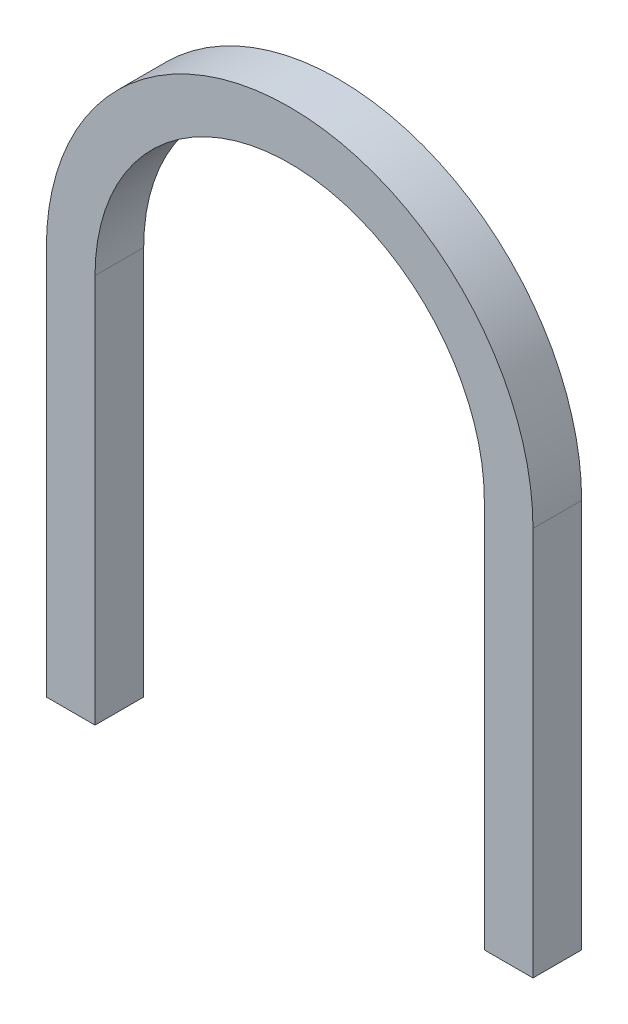
ISO-10303-21;
HEADER;
FILE_DESCRIPTION(('STEP AP214'),'2;1');
FILE_NAME('part.step','',(''),(''),'','','');
FILE_SCHEMA(('AUTOMOTIVE_DESIGN { 1 0 10303 214 1 1 1 1 }'));
ENDSEC;
DATA;
#1=APPLICATION_CONTEXT('core data for automotive mechanical design processes');
#2=APPLICATION_PROTOCOL_DEFINITION('international standard','automotive_design',2000,#1);
#3=PRODUCT_CONTEXT('',#1,'mechanical');
#4=PRODUCT('Part','Part','',(#3));
#5=PRODUCT_RELATED_PRODUCT_CATEGORY('part','',(#4));
#6=PRODUCT_DEFINITION_FORMATION('','',#4);
#7=PRODUCT_DEFINITION_CONTEXT('part definition',#1,'design');
#8=PRODUCT_DEFINITION('design','',#6,#7);
#9=PRODUCT_DEFINITION_SHAPE('','',#8);
#10=(LENGTH_UNIT() NAMED_UNIT(*) SI_UNIT(.MILLI.,.METRE.));
#11=(NAMED_UNIT(*) PLANE_ANGLE_UNIT() SI_UNIT($,.RADIAN.));
#12=(NAMED_UNIT(*) SI_UNIT($,.STERADIAN.) SOLID_ANGLE_UNIT());
#13=UNCERTAINTY_MEASURE_WITH_UNIT(LENGTH_MEASURE(1.E-05),#10,'distance_accuracy_value','');
#14=(GEOMETRIC_REPRESENTATION_CONTEXT(3) GLOBAL_UNCERTAINTY_ASSIGNED_CONTEXT((#13)) GLOBAL_UNIT_ASSIGNED_CONTEXT((#10,
#11,#12)) REPRESENTATION_CONTEXT('',''));
#15=CARTESIAN_POINT('',(0.,0.,0.));
#16=DIRECTION('',(0.,0.,1.));
#17=DIRECTION('',(1.,0.,0.));
#18=AXIS2_PLACEMENT_3D('',#15,#16,#17);
#19=CARTESIAN_POINT('',(-20.,0.,5.));
#20=DIRECTION('',(0.,1.,0.));
#21=DIRECTION('',(-1.,0.,0.));
#22=AXIS2_PLACEMENT_3D('',#19,#20,#21);
#23=PLANE('',#22);
#24=DIRECTION('',(1.,0.,0.));
#25=VECTOR('',#24,1.);
#26=CARTESIAN_POINT('',(-20.,0.,0.));
#27=LINE('',#26,#25);
#28=CARTESIAN_POINT('',(-25.,0.,0.));
#29=VERTEX_POINT('',#28);
#30=CARTESIAN_POINT('',(-20.,0.,0.));
#31=VERTEX_POINT('',#30);
#32=EDGE_CURVE('E128',#29,#31,#27,.T.);
#33=ORIENTED_EDGE('',*,*,#32,.T.);
#34=DIRECTION('',(0.,0.,-1.));
#35=VECTOR('',#34,1.);
#36=CARTESIAN_POINT('',(-20.,0.,5.));
#37=LINE('',#36,#35);
#38=CARTESIAN_POINT('',(-20.,0.,5.));
#39=VERTEX_POINT('',#38);
#40=EDGE_CURVE('E11',#39,#31,#37,.T.);
#41=ORIENTED_EDGE('',*,*,#40,.F.);
#42=DIRECTION('',(1.,0.,0.));
#43=VECTOR('',#42,1.);
#44=CARTESIAN_POINT('',(-20.,0.,5.));
#45=LINE('',#44,#43);
#46=CARTESIAN_POINT('',(-25.,0.,5.));
#47=VERTEX_POINT('',#46);
#48=EDGE_CURVE('E142',#47,#39,#45,.T.);
#49=ORIENTED_EDGE('',*,*,#48,.F.);
#50=DIRECTION('',(0.,0.,-1.));
#51=VECTOR('',#50,1.);
#52=CARTESIAN_POINT('',(-25.,0.,5.));
#53=LINE('',#52,#51);
#54=EDGE_CURVE('E124',#47,#29,#53,.T.);
#55=ORIENTED_EDGE('',*,*,#54,.T.);
#56=EDGE_LOOP('',(#33,#41,#49,#55));
#57=FACE_BOUND('',#56,.T.);
#58=ADVANCED_FACE('F32',(#57),#23,.F.);
#59=CARTESIAN_POINT('',(-20.,0.,5.));
#60=DIRECTION('',(-1.,0.,0.));
#61=DIRECTION('',(0.,-1.,0.));
#62=AXIS2_PLACEMENT_3D('',#59,#60,#61);
#63=PLANE('',#62);
#64=DIRECTION('',(0.,1.,0.));
#65=VECTOR('',#64,1.);
#66=CARTESIAN_POINT('',(-20.,0.,0.));
#67=LINE('',#66,#65);
#68=CARTESIAN_POINT('',(-20.,40.,0.));
#69=VERTEX_POINT('',#68);
#70=EDGE_CURVE('E131',#31,#69,#67,.T.);
#71=ORIENTED_EDGE('',*,*,#70,.T.);
#72=DIRECTION('',(0.,0.,-1.));
#73=VECTOR('',#72,1.);
#74=CARTESIAN_POINT('',(-20.,40.,5.));
#75=LINE('',#74,#73);
#76=CARTESIAN_POINT('',(-20.,40.,5.));
#77=VERTEX_POINT('',#76);
#78=EDGE_CURVE('E40',#77,#69,#75,.T.);
#79=ORIENTED_EDGE('',*,*,#78,.F.);
#80=DIRECTION('',(0.,1.,0.));
#81=VECTOR('',#80,1.);
#82=CARTESIAN_POINT('',(-20.,0.,5.));
#83=LINE('',#82,#81);
#84=EDGE_CURVE('E91',#39,#77,#83,.T.);
#85=ORIENTED_EDGE('',*,*,#84,.F.);
#86=ORIENTED_EDGE('',*,*,#40,.T.);
#87=EDGE_LOOP('',(#71,#79,#85,#86));
#88=FACE_BOUND('',#87,.T.);
#89=ADVANCED_FACE('F177',(#88),#63,.F.);
#90=CARTESIAN_POINT('',(0.,40.,5.));
#91=DIRECTION('',(0.,0.,-1.));
#92=DIRECTION('',(-1.,0.,0.));
#93=AXIS2_PLACEMENT_3D('',#90,#91,#92);
#94=CYLINDRICAL_SURFACE('',#93,20.);
#95=CARTESIAN_POINT('',(0.,40.,0.));
#96=DIRECTION('',(0.,0.,-1.));
#97=DIRECTION('',(-1.,0.,0.));
#98=AXIS2_PLACEMENT_3D('',#95,#96,#97);
#99=CIRCLE('',#98,20.);
#100=CARTESIAN_POINT('',(20.,40.,0.));
#101=VERTEX_POINT('',#100);
#102=EDGE_CURVE('E133',#69,#101,#99,.T.);
#103=ORIENTED_EDGE('',*,*,#102,.T.);
#104=DIRECTION('',(0.,0.,-1.));
#105=VECTOR('',#104,1.);
#106=CARTESIAN_POINT('',(20.,40.,5.));
#107=LINE('',#106,#105);
#108=CARTESIAN_POINT('',(20.,40.,5.));
#109=VERTEX_POINT('',#108);
#110=EDGE_CURVE('E149',#109,#101,#107,.T.);
#111=ORIENTED_EDGE('',*,*,#110,.F.);
#112=CARTESIAN_POINT('',(0.,40.,5.));
#113=DIRECTION('',(0.,0.,-1.));
#114=DIRECTION('',(-1.,0.,0.));
#115=AXIS2_PLACEMENT_3D('',#112,#113,#114);
#116=CIRCLE('',#115,20.);
#117=EDGE_CURVE('E157',#77,#109,#116,.T.);
#118=ORIENTED_EDGE('',*,*,#117,.F.);
#119=ORIENTED_EDGE('',*,*,#78,.T.);
#120=EDGE_LOOP('',(#103,#111,#118,#119));
#121=FACE_BOUND('',#120,.T.);
#122=ADVANCED_FACE('F155',(#121),#94,.F.);
#123=CARTESIAN_POINT('',(20.,40.,5.));
#124=DIRECTION('',(1.,0.,0.));
#125=DIRECTION('',(0.,1.,0.));
#126=AXIS2_PLACEMENT_3D('',#123,#124,#125);
#127=PLANE('',#126);
#128=DIRECTION('',(0.,-1.,0.));
#129=VECTOR('',#128,1.);
#130=CARTESIAN_POINT('',(20.,40.,0.));
#131=LINE('',#130,#129);
#132=CARTESIAN_POINT('',(20.,0.,0.));
#133=VERTEX_POINT('',#132);
#134=EDGE_CURVE('E135',#101,#133,#131,.T.);
#135=ORIENTED_EDGE('',*,*,#134,.T.);
#136=DIRECTION('',(0.,0.,-1.));
#137=VECTOR('',#136,1.);
#138=CARTESIAN_POINT('',(20.,0.,5.));
#139=LINE('',#138,#137);
#140=CARTESIAN_POINT('',(20.,0.,5.));
#141=VERTEX_POINT('',#140);
#142=EDGE_CURVE('E146',#141,#133,#139,.T.);
#143=ORIENTED_EDGE('',*,*,#142,.F.);
#144=DIRECTION('',(0.,-1.,0.));
#145=VECTOR('',#144,1.);
#146=CARTESIAN_POINT('',(20.,40.,5.));
#147=LINE('',#146,#145);
#148=EDGE_CURVE('E169',#109,#141,#147,.T.);
#149=ORIENTED_EDGE('',*,*,#148,.F.);
#150=ORIENTED_EDGE('',*,*,#110,.T.);
#151=EDGE_LOOP('',(#135,#143,#149,#150));
#152=FACE_BOUND('',#151,.T.);
#153=ADVANCED_FACE('F165',(#152),#127,.F.);
#154=CARTESIAN_POINT('',(20.,0.,5.));
#155=DIRECTION('',(0.,1.,0.));
#156=DIRECTION('',(-1.,0.,0.));
#157=AXIS2_PLACEMENT_3D('',#154,#155,#156);
#158=PLANE('',#157);
#159=DIRECTION('',(1.,0.,0.));
#160=VECTOR('',#159,1.);
#161=CARTESIAN_POINT('',(20.,0.,0.));
#162=LINE('',#161,#160);
#163=CARTESIAN_POINT('',(25.,0.,0.));
#164=VERTEX_POINT('',#163);
#165=EDGE_CURVE('E137',#133,#164,#162,.T.);
#166=ORIENTED_EDGE('',*,*,#165,.T.);
#167=DIRECTION('',(0.,0.,-1.));
#168=VECTOR('',#167,1.);
#169=CARTESIAN_POINT('',(25.,0.,5.));
#170=LINE('',#169,#168);
#171=CARTESIAN_POINT('',(25.,0.,5.));
#172=VERTEX_POINT('',#171);
#173=EDGE_CURVE('E119',#172,#164,#170,.T.);
#174=ORIENTED_EDGE('',*,*,#173,.F.);
#175=DIRECTION('',(1.,0.,0.));
#176=VECTOR('',#175,1.);
#177=CARTESIAN_POINT('',(20.,0.,5.));
#178=LINE('',#177,#176);
#179=EDGE_CURVE('E110',#141,#172,#178,.T.);
#180=ORIENTED_EDGE('',*,*,#179,.F.);
#181=ORIENTED_EDGE('',*,*,#142,.T.);
#182=EDGE_LOOP('',(#166,#174,#180,#181));
#183=FACE_BOUND('',#182,.T.);
#184=ADVANCED_FACE('F168',(#183),#158,.F.);
#185=CARTESIAN_POINT('',(25.,0.,5.));
#186=DIRECTION('',(-1.,0.,0.));
#187=DIRECTION('',(0.,0.,1.));
#188=AXIS2_PLACEMENT_3D('',#185,#186,#187);
#189=PLANE('',#188);
#190=DIRECTION('',(0.,1.,0.));
#191=VECTOR('',#190,1.);
#192=CARTESIAN_POINT('',(25.,0.,0.));
#193=LINE('',#192,#191);
#194=CARTESIAN_POINT('',(25.,40.,0.));
#195=VERTEX_POINT('',#194);
#196=EDGE_CURVE('E118',#164,#195,#193,.T.);
#197=ORIENTED_EDGE('',*,*,#196,.T.);
#198=DIRECTION('',(0.,0.,-1.));
#199=VECTOR('',#198,1.);
#200=CARTESIAN_POINT('',(25.,40.,5.));
#201=LINE('',#200,#199);
#202=CARTESIAN_POINT('',(25.,40.,5.));
#203=VERTEX_POINT('',#202);
#204=EDGE_CURVE('E115',#203,#195,#201,.T.);
#205=ORIENTED_EDGE('',*,*,#204,.F.);
#206=DIRECTION('',(0.,1.,0.));
#207=VECTOR('',#206,1.);
#208=CARTESIAN_POINT('',(25.,0.,5.));
#209=LINE('',#208,#207);
#210=EDGE_CURVE('E104',#172,#203,#209,.T.);
#211=ORIENTED_EDGE('',*,*,#210,.F.);
#212=ORIENTED_EDGE('',*,*,#173,.T.);
#213=EDGE_LOOP('',(#197,#205,#211,#212));
#214=FACE_BOUND('',#213,.T.);
#215=ADVANCED_FACE('F116',(#214),#189,.F.);
#216=CARTESIAN_POINT('',(0.,40.,5.));
#217=DIRECTION('',(0.,0.,-1.));
#218=DIRECTION('',(-1.,0.,0.));
#219=AXIS2_PLACEMENT_3D('',#216,#217,#218);
#220=CYLINDRICAL_SURFACE('',#219,25.);
#221=CARTESIAN_POINT('',(0.,40.,0.));
#222=DIRECTION('',(0.,0.,1.));
#223=DIRECTION('',(1.,0.,0.));
#224=AXIS2_PLACEMENT_3D('',#221,#222,#223);
#225=CIRCLE('',#224,25.);
#226=CARTESIAN_POINT('',(-25.,40.,0.));
#227=VERTEX_POINT('',#226);
#228=EDGE_CURVE('E77',#195,#227,#225,.T.);
#229=ORIENTED_EDGE('',*,*,#228,.T.);
#230=DIRECTION('',(0.,0.,-1.));
#231=VECTOR('',#230,1.);
#232=CARTESIAN_POINT('',(-25.,40.,5.));
#233=LINE('',#232,#231);
#234=CARTESIAN_POINT('',(-25.,40.,5.));
#235=VERTEX_POINT('',#234);
#236=EDGE_CURVE('E120',#235,#227,#233,.T.);
#237=ORIENTED_EDGE('',*,*,#236,.F.);
#238=CARTESIAN_POINT('',(0.,40.,5.));
#239=DIRECTION('',(0.,0.,1.));
#240=DIRECTION('',(1.,0.,0.));
#241=AXIS2_PLACEMENT_3D('',#238,#239,#240);
#242=CIRCLE('',#241,25.);
#243=EDGE_CURVE('E108',#203,#235,#242,.T.);
#244=ORIENTED_EDGE('',*,*,#243,.F.);
#245=ORIENTED_EDGE('',*,*,#204,.T.);
#246=EDGE_LOOP('',(#229,#237,#244,#245));
#247=FACE_BOUND('',#246,.T.);
#248=ADVANCED_FACE('F122',(#247),#220,.T.);
#249=CARTESIAN_POINT('',(-25.,0.,5.));
#250=DIRECTION('',(1.,0.,0.));
#251=DIRECTION('',(0.,0.,-1.));
#252=AXIS2_PLACEMENT_3D('',#249,#250,#251);
#253=PLANE('',#252);
#254=DIRECTION('',(0.,-1.,0.));
#255=VECTOR('',#254,1.);
#256=CARTESIAN_POINT('',(-25.,0.,0.));
#257=LINE('',#256,#255);
#258=EDGE_CURVE('E83',#227,#29,#257,.T.);
#259=ORIENTED_EDGE('',*,*,#258,.T.);
#260=ORIENTED_EDGE('',*,*,#54,.F.);
#261=DIRECTION('',(0.,-1.,0.));
#262=VECTOR('',#261,1.);
#263=CARTESIAN_POINT('',(-25.,0.,5.));
#264=LINE('',#263,#262);
#265=EDGE_CURVE('E48',#235,#47,#264,.T.);
#266=ORIENTED_EDGE('',*,*,#265,.F.);
#267=ORIENTED_EDGE('',*,*,#236,.T.);
#268=EDGE_LOOP('',(#259,#260,#266,#267));
#269=FACE_BOUND('',#268,.T.);
#270=ADVANCED_FACE('F193',(#269),#253,.F.);
#271=CARTESIAN_POINT('',(0.,40.,5.));
#272=DIRECTION('',(0.,0.,1.));
#273=DIRECTION('',(1.,0.,0.));
#274=AXIS2_PLACEMENT_3D('',#271,#272,#273);
#275=PLANE('',#274);
#276=ORIENTED_EDGE('',*,*,#48,.T.);
#277=ORIENTED_EDGE('',*,*,#84,.T.);
#278=ORIENTED_EDGE('',*,*,#117,.T.);
#279=ORIENTED_EDGE('',*,*,#148,.T.);
#280=ORIENTED_EDGE('',*,*,#179,.T.);
#281=ORIENTED_EDGE('',*,*,#210,.T.);
#282=ORIENTED_EDGE('',*,*,#243,.T.);
#283=ORIENTED_EDGE('',*,*,#265,.T.);
#284=EDGE_LOOP('',(#276,#277,#278,#279,#280,#281,#282,#283));
#285=FACE_BOUND('',#284,.T.);
#286=ADVANCED_FACE('F106',(#285),#275,.T.);
#287=CARTESIAN_POINT('',(0.,40.,0.));
#288=DIRECTION('',(0.,0.,1.));
#289=DIRECTION('',(1.,0.,0.));
#290=AXIS2_PLACEMENT_3D('',#287,#288,#289);
#291=PLANE('',#290);
#292=ORIENTED_EDGE('',*,*,#32,.F.);
#293=ORIENTED_EDGE('',*,*,#258,.F.);
#294=ORIENTED_EDGE('',*,*,#228,.F.);
#295=ORIENTED_EDGE('',*,*,#196,.F.);
#296=ORIENTED_EDGE('',*,*,#165,.F.);
#297=ORIENTED_EDGE('',*,*,#134,.F.);
#298=ORIENTED_EDGE('',*,*,#102,.F.);
#299=ORIENTED_EDGE('',*,*,#70,.F.);
#300=EDGE_LOOP('',(#292,#293,#294,#295,#296,#297,#298,#299));
#301=FACE_BOUND('',#300,.T.);
#302=ADVANCED_FACE('F161',(#301),#291,.F.);
#303=CLOSED_SHELL('',(#58,#89,#122,#153,#184,#215,#248,#270,#286,#302));
#304=MANIFOLD_SOLID_BREP('B2',#303);
#305=ADVANCED_BREP_SHAPE_REPRESENTATION('',(#18,#304),#14);
#306=SHAPE_DEFINITION_REPRESENTATION(#9,#305);
ENDSEC;
END-ISO-10303-21;
